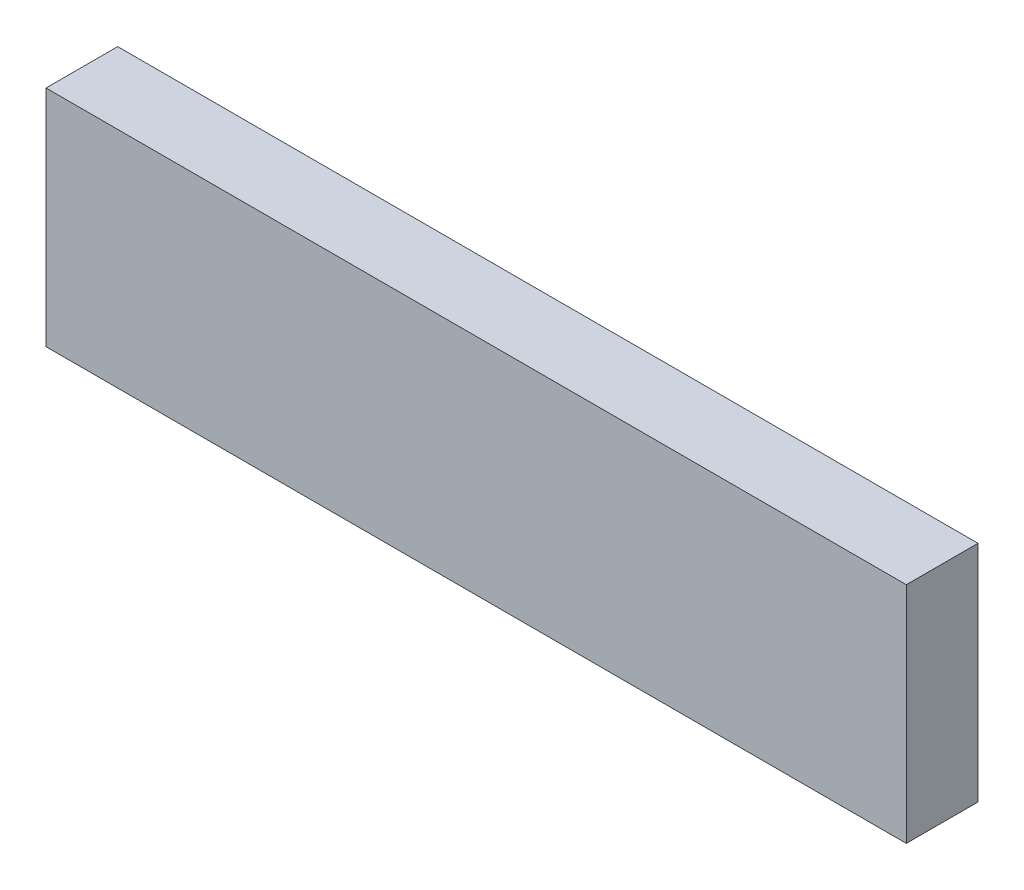
ISO-10303-21;
HEADER;
FILE_DESCRIPTION(('STEP AP214'),'2;1');
FILE_NAME('part.step','',(''),(''),'','','');
FILE_SCHEMA(('AUTOMOTIVE_DESIGN { 1 0 10303 214 1 1 1 1 }'));
ENDSEC;
DATA;
#1=APPLICATION_CONTEXT('core data for automotive mechanical design processes');
#2=APPLICATION_PROTOCOL_DEFINITION('international standard','automotive_design',2000,#1);
#3=PRODUCT_CONTEXT('',#1,'mechanical');
#4=PRODUCT('Part','Part','',(#3));
#5=PRODUCT_RELATED_PRODUCT_CATEGORY('part','',(#4));
#6=PRODUCT_DEFINITION_FORMATION('','',#4);
#7=PRODUCT_DEFINITION_CONTEXT('part definition',#1,'design');
#8=PRODUCT_DEFINITION('design','',#6,#7);
#9=PRODUCT_DEFINITION_SHAPE('','',#8);
#10=(LENGTH_UNIT() NAMED_UNIT(*) SI_UNIT(.MILLI.,.METRE.));
#11=(NAMED_UNIT(*) PLANE_ANGLE_UNIT() SI_UNIT($,.RADIAN.));
#12=(NAMED_UNIT(*) SI_UNIT($,.STERADIAN.) SOLID_ANGLE_UNIT());
#13=UNCERTAINTY_MEASURE_WITH_UNIT(LENGTH_MEASURE(1.E-05),#10,'distance_accuracy_value','');
#14=(GEOMETRIC_REPRESENTATION_CONTEXT(3) GLOBAL_UNCERTAINTY_ASSIGNED_CONTEXT((#13)) GLOBAL_UNIT_ASSIGNED_CONTEXT((#10,
#11,#12)) REPRESENTATION_CONTEXT('',''));
#15=CARTESIAN_POINT('',(0.,0.,0.));
#16=DIRECTION('',(0.,0.,1.));
#17=DIRECTION('',(1.,0.,0.));
#18=AXIS2_PLACEMENT_3D('',#15,#16,#17);
#19=CARTESIAN_POINT('',(152.4,39.6875,12.7));
#20=DIRECTION('',(-1.,0.,0.));
#21=DIRECTION('',(0.,0.,1.));
#22=AXIS2_PLACEMENT_3D('',#19,#20,#21);
#23=PLANE('',#22);
#24=DIRECTION('',(0.,0.,-1.));
#25=VECTOR('',#24,1.);
#26=CARTESIAN_POINT('',(152.4,-39.6875,12.7));
#27=LINE('',#26,#25);
#28=CARTESIAN_POINT('',(152.4,-39.6875,12.7));
#29=VERTEX_POINT('',#28);
#30=CARTESIAN_POINT('',(152.4,-39.6875,-12.7));
#31=VERTEX_POINT('',#30);
#32=EDGE_CURVE('E107',#29,#31,#27,.T.);
#33=ORIENTED_EDGE('',*,*,#32,.T.);
#34=DIRECTION('',(0.,-1.,0.));
#35=VECTOR('',#34,1.);
#36=CARTESIAN_POINT('',(152.4,39.6875,-12.7));
#37=LINE('',#36,#35);
#38=CARTESIAN_POINT('',(152.4,39.6875,-12.7));
#39=VERTEX_POINT('',#38);
#40=EDGE_CURVE('E11',#39,#31,#37,.T.);
#41=ORIENTED_EDGE('',*,*,#40,.F.);
#42=DIRECTION('',(0.,0.,-1.));
#43=VECTOR('',#42,1.);
#44=CARTESIAN_POINT('',(152.4,39.6875,12.7));
#45=LINE('',#44,#43);
#46=CARTESIAN_POINT('',(152.4,39.6875,12.7));
#47=VERTEX_POINT('',#46);
#48=EDGE_CURVE('E91',#47,#39,#45,.T.);
#49=ORIENTED_EDGE('',*,*,#48,.F.);
#50=DIRECTION('',(0.,-1.,0.));
#51=VECTOR('',#50,1.);
#52=CARTESIAN_POINT('',(152.4,39.6875,12.7));
#53=LINE('',#52,#51);
#54=EDGE_CURVE('E103',#47,#29,#53,.T.);
#55=ORIENTED_EDGE('',*,*,#54,.T.);
#56=EDGE_LOOP('',(#33,#41,#49,#55));
#57=FACE_BOUND('',#56,.T.);
#58=ADVANCED_FACE('F39',(#57),#23,.F.);
#59=CARTESIAN_POINT('',(-152.4,39.6875,-12.7));
#60=DIRECTION('',(0.,0.,1.));
#61=DIRECTION('',(1.,0.,0.));
#62=AXIS2_PLACEMENT_3D('',#59,#60,#61);
#63=PLANE('',#62);
#64=DIRECTION('',(-1.,0.,0.));
#65=VECTOR('',#64,1.);
#66=CARTESIAN_POINT('',(-152.4,-39.6875,-12.7));
#67=LINE('',#66,#65);
#68=CARTESIAN_POINT('',(-152.4,-39.6875,-12.7));
#69=VERTEX_POINT('',#68);
#70=EDGE_CURVE('E96',#31,#69,#67,.T.);
#71=ORIENTED_EDGE('',*,*,#70,.T.);
#72=DIRECTION('',(0.,-1.,0.));
#73=VECTOR('',#72,1.);
#74=CARTESIAN_POINT('',(-152.4,39.6875,-12.7));
#75=LINE('',#74,#73);
#76=CARTESIAN_POINT('',(-152.4,39.6875,-12.7));
#77=VERTEX_POINT('',#76);
#78=EDGE_CURVE('E48',#77,#69,#75,.T.);
#79=ORIENTED_EDGE('',*,*,#78,.F.);
#80=DIRECTION('',(-1.,0.,0.));
#81=VECTOR('',#80,1.);
#82=CARTESIAN_POINT('',(-152.4,39.6875,-12.7));
#83=LINE('',#82,#81);
#84=EDGE_CURVE('E86',#39,#77,#83,.T.);
#85=ORIENTED_EDGE('',*,*,#84,.F.);
#86=ORIENTED_EDGE('',*,*,#40,.T.);
#87=EDGE_LOOP('',(#71,#79,#85,#86));
#88=FACE_BOUND('',#87,.T.);
#89=ADVANCED_FACE('F95',(#88),#63,.F.);
#90=CARTESIAN_POINT('',(-152.4,39.6875,12.7));
#91=DIRECTION('',(1.,0.,0.));
#92=DIRECTION('',(0.,0.,-1.));
#93=AXIS2_PLACEMENT_3D('',#90,#91,#92);
#94=PLANE('',#93);
#95=DIRECTION('',(0.,0.,1.));
#96=VECTOR('',#95,1.);
#97=CARTESIAN_POINT('',(-152.4,-39.6875,12.7));
#98=LINE('',#97,#96);
#99=CARTESIAN_POINT('',(-152.4,-39.6875,12.7));
#100=VERTEX_POINT('',#99);
#101=EDGE_CURVE('E73',#69,#100,#98,.T.);
#102=ORIENTED_EDGE('',*,*,#101,.T.);
#103=DIRECTION('',(0.,-1.,0.));
#104=VECTOR('',#103,1.);
#105=CARTESIAN_POINT('',(-152.4,39.6875,12.7));
#106=LINE('',#105,#104);
#107=CARTESIAN_POINT('',(-152.4,39.6875,12.7));
#108=VERTEX_POINT('',#107);
#109=EDGE_CURVE('E98',#108,#100,#106,.T.);
#110=ORIENTED_EDGE('',*,*,#109,.F.);
#111=DIRECTION('',(0.,0.,1.));
#112=VECTOR('',#111,1.);
#113=CARTESIAN_POINT('',(-152.4,39.6875,12.7));
#114=LINE('',#113,#112);
#115=EDGE_CURVE('E89',#77,#108,#114,.T.);
#116=ORIENTED_EDGE('',*,*,#115,.F.);
#117=ORIENTED_EDGE('',*,*,#78,.T.);
#118=EDGE_LOOP('',(#102,#110,#116,#117));
#119=FACE_BOUND('',#118,.T.);
#120=ADVANCED_FACE('F99',(#119),#94,.F.);
#121=CARTESIAN_POINT('',(-152.4,39.6875,12.7));
#122=DIRECTION('',(0.,0.,-1.));
#123=DIRECTION('',(-1.,0.,0.));
#124=AXIS2_PLACEMENT_3D('',#121,#122,#123);
#125=PLANE('',#124);
#126=DIRECTION('',(1.,0.,0.));
#127=VECTOR('',#126,1.);
#128=CARTESIAN_POINT('',(-152.4,-39.6875,12.7));
#129=LINE('',#128,#127);
#130=EDGE_CURVE('E79',#100,#29,#129,.T.);
#131=ORIENTED_EDGE('',*,*,#130,.T.);
#132=ORIENTED_EDGE('',*,*,#54,.F.);
#133=DIRECTION('',(1.,0.,0.));
#134=VECTOR('',#133,1.);
#135=CARTESIAN_POINT('',(-152.4,39.6875,12.7));
#136=LINE('',#135,#134);
#137=EDGE_CURVE('E56',#108,#47,#136,.T.);
#138=ORIENTED_EDGE('',*,*,#137,.F.);
#139=ORIENTED_EDGE('',*,*,#109,.T.);
#140=EDGE_LOOP('',(#131,#132,#138,#139));
#141=FACE_BOUND('',#140,.T.);
#142=ADVANCED_FACE('F120',(#141),#125,.F.);
#143=CARTESIAN_POINT('',(0.,39.6875,0.));
#144=DIRECTION('',(0.,-1.,0.));
#145=DIRECTION('',(0.,0.,-1.));
#146=AXIS2_PLACEMENT_3D('',#143,#144,#145);
#147=PLANE('',#146);
#148=ORIENTED_EDGE('',*,*,#48,.T.);
#149=ORIENTED_EDGE('',*,*,#84,.T.);
#150=ORIENTED_EDGE('',*,*,#115,.T.);
#151=ORIENTED_EDGE('',*,*,#137,.T.);
#152=EDGE_LOOP('',(#148,#149,#150,#151));
#153=FACE_BOUND('',#152,.T.);
#154=ADVANCED_FACE('F87',(#153),#147,.F.);
#155=CARTESIAN_POINT('',(0.,-39.6875,0.));
#156=DIRECTION('',(0.,-1.,0.));
#157=DIRECTION('',(0.,0.,-1.));
#158=AXIS2_PLACEMENT_3D('',#155,#156,#157);
#159=PLANE('',#158);
#160=ORIENTED_EDGE('',*,*,#32,.F.);
#161=ORIENTED_EDGE('',*,*,#130,.F.);
#162=ORIENTED_EDGE('',*,*,#101,.F.);
#163=ORIENTED_EDGE('',*,*,#70,.F.);
#164=EDGE_LOOP('',(#160,#161,#162,#163));
#165=FACE_BOUND('',#164,.T.);
#166=ADVANCED_FACE('F123',(#165),#159,.T.);
#167=CLOSED_SHELL('',(#58,#89,#120,#142,#154,#166));
#168=MANIFOLD_SOLID_BREP('B2',#167);
#169=ADVANCED_BREP_SHAPE_REPRESENTATION('',(#18,#168),#14);
#170=SHAPE_DEFINITION_REPRESENTATION(#9,#169);
ENDSEC;
END-ISO-10303-21;
